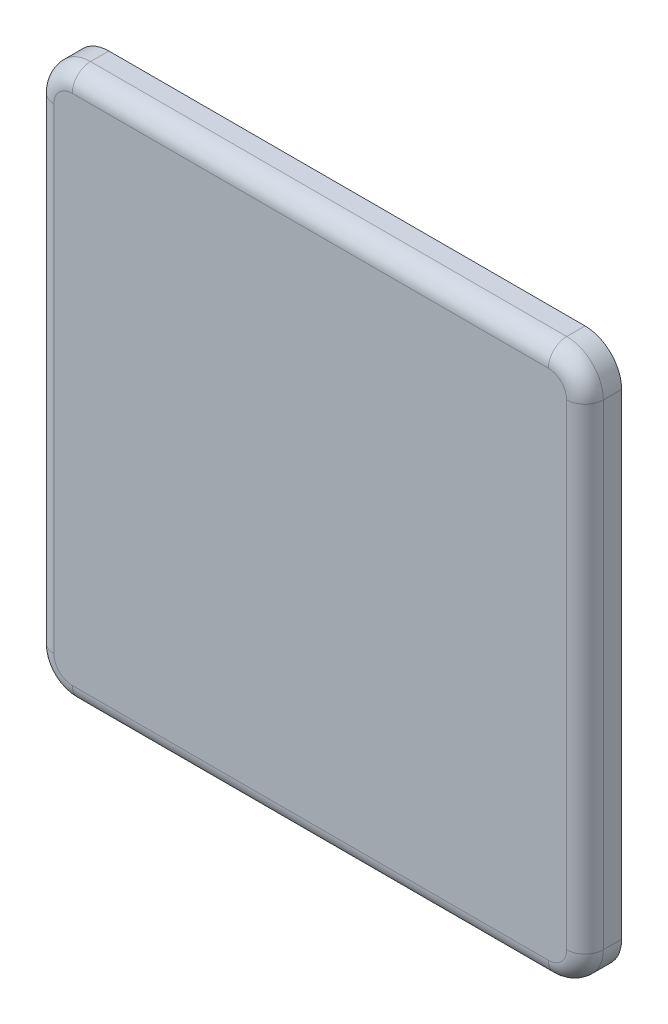
ISO-10303-21;
HEADER;
FILE_DESCRIPTION(('STEP AP214'),'2;1');
FILE_NAME('part.step','',(''),(''),'','','');
FILE_SCHEMA(('AUTOMOTIVE_DESIGN { 1 0 10303 214 1 1 1 1 }'));
ENDSEC;
DATA;
#1=APPLICATION_CONTEXT('core data for automotive mechanical design processes');
#2=APPLICATION_PROTOCOL_DEFINITION('international standard','automotive_design',2000,#1);
#3=PRODUCT_CONTEXT('',#1,'mechanical');
#4=PRODUCT('Part','Part','',(#3));
#5=PRODUCT_RELATED_PRODUCT_CATEGORY('part','',(#4));
#6=PRODUCT_DEFINITION_FORMATION('','',#4);
#7=PRODUCT_DEFINITION_CONTEXT('part definition',#1,'design');
#8=PRODUCT_DEFINITION('design','',#6,#7);
#9=PRODUCT_DEFINITION_SHAPE('','',#8);
#10=(LENGTH_UNIT() NAMED_UNIT(*) SI_UNIT(.MILLI.,.METRE.));
#11=(NAMED_UNIT(*) PLANE_ANGLE_UNIT() SI_UNIT($,.RADIAN.));
#12=(NAMED_UNIT(*) SI_UNIT($,.STERADIAN.) SOLID_ANGLE_UNIT());
#13=UNCERTAINTY_MEASURE_WITH_UNIT(LENGTH_MEASURE(1.E-05),#10,'distance_accuracy_value','');
#14=(GEOMETRIC_REPRESENTATION_CONTEXT(3) GLOBAL_UNCERTAINTY_ASSIGNED_CONTEXT((#13)) GLOBAL_UNIT_ASSIGNED_CONTEXT((#10,
#11,#12)) REPRESENTATION_CONTEXT('',''));
#15=CARTESIAN_POINT('',(0.,0.,0.));
#16=DIRECTION('',(0.,0.,1.));
#17=DIRECTION('',(1.,0.,0.));
#18=AXIS2_PLACEMENT_3D('',#15,#16,#17);
#19=CARTESIAN_POINT('',(0.,0.,0.));
#20=DIRECTION('',(0.,0.,1.));
#21=DIRECTION('',(1.,0.,0.));
#22=AXIS2_PLACEMENT_3D('',#19,#20,#21);
#23=PLANE('',#22);
#24=DIRECTION('',(1.,0.,0.));
#25=VECTOR('',#24,1.);
#26=CARTESIAN_POINT('',(-13.,15.,0.));
#27=LINE('',#26,#25);
#28=CARTESIAN_POINT('',(-13.,15.,0.));
#29=VERTEX_POINT('',#28);
#30=CARTESIAN_POINT('',(13.,15.,0.));
#31=VERTEX_POINT('',#30);
#32=EDGE_CURVE('E150',#29,#31,#27,.T.);
#33=ORIENTED_EDGE('',*,*,#32,.T.);
#34=CARTESIAN_POINT('',(13.,13.,0.));
#35=DIRECTION('',(0.,0.,-1.));
#36=DIRECTION('',(-1.,0.,0.));
#37=AXIS2_PLACEMENT_3D('',#34,#35,#36);
#38=CIRCLE('',#37,2.);
#39=CARTESIAN_POINT('',(15.,13.,0.));
#40=VERTEX_POINT('',#39);
#41=EDGE_CURVE('E55',#31,#40,#38,.T.);
#42=ORIENTED_EDGE('',*,*,#41,.T.);
#43=DIRECTION('',(0.,-1.,0.));
#44=VECTOR('',#43,1.);
#45=CARTESIAN_POINT('',(15.,13.,0.));
#46=LINE('',#45,#44);
#47=CARTESIAN_POINT('',(15.,-13.,0.));
#48=VERTEX_POINT('',#47);
#49=EDGE_CURVE('E211',#40,#48,#46,.T.);
#50=ORIENTED_EDGE('',*,*,#49,.T.);
#51=CARTESIAN_POINT('',(13.,-13.,0.));
#52=DIRECTION('',(0.,0.,-1.));
#53=DIRECTION('',(0.,1.,0.));
#54=AXIS2_PLACEMENT_3D('',#51,#52,#53);
#55=CIRCLE('',#54,2.);
#56=CARTESIAN_POINT('',(13.,-15.,0.));
#57=VERTEX_POINT('',#56);
#58=EDGE_CURVE('E110',#48,#57,#55,.T.);
#59=ORIENTED_EDGE('',*,*,#58,.T.);
#60=DIRECTION('',(-1.,0.,0.));
#61=VECTOR('',#60,1.);
#62=CARTESIAN_POINT('',(13.,-15.,0.));
#63=LINE('',#62,#61);
#64=CARTESIAN_POINT('',(-13.,-15.,0.));
#65=VERTEX_POINT('',#64);
#66=EDGE_CURVE('E109',#57,#65,#63,.T.);
#67=ORIENTED_EDGE('',*,*,#66,.T.);
#68=CARTESIAN_POINT('',(-13.,-13.,0.));
#69=DIRECTION('',(0.,0.,-1.));
#70=DIRECTION('',(1.,0.,0.));
#71=AXIS2_PLACEMENT_3D('',#68,#69,#70);
#72=CIRCLE('',#71,2.);
#73=CARTESIAN_POINT('',(-15.,-13.,0.));
#74=VERTEX_POINT('',#73);
#75=EDGE_CURVE('E106',#65,#74,#72,.T.);
#76=ORIENTED_EDGE('',*,*,#75,.T.);
#77=DIRECTION('',(0.,1.,0.));
#78=VECTOR('',#77,1.);
#79=CARTESIAN_POINT('',(-15.,-13.,0.));
#80=LINE('',#79,#78);
#81=CARTESIAN_POINT('',(-15.,13.,0.));
#82=VERTEX_POINT('',#81);
#83=EDGE_CURVE('E25',#74,#82,#80,.T.);
#84=ORIENTED_EDGE('',*,*,#83,.T.);
#85=CARTESIAN_POINT('',(-13.,13.,0.));
#86=DIRECTION('',(0.,0.,-1.));
#87=DIRECTION('',(0.,-1.,0.));
#88=AXIS2_PLACEMENT_3D('',#85,#86,#87);
#89=CIRCLE('',#88,2.);
#90=EDGE_CURVE('E10',#82,#29,#89,.T.);
#91=ORIENTED_EDGE('',*,*,#90,.T.);
#92=EDGE_LOOP('',(#33,#42,#50,#59,#67,#76,#84,#91));
#93=FACE_BOUND('',#92,.T.);
#94=ADVANCED_FACE('F15',(#93),#23,.F.);
#95=CARTESIAN_POINT('',(-13.,13.,0.));
#96=DIRECTION('',(0.,0.,-1.));
#97=DIRECTION('',(0.,-1.,0.));
#98=AXIS2_PLACEMENT_3D('',#95,#96,#97);
#99=CYLINDRICAL_SURFACE('',#98,2.);
#100=CARTESIAN_POINT('',(-13.,13.,1.));
#101=DIRECTION('',(0.,0.,1.));
#102=DIRECTION('',(-0.707106781186548,0.707106781186548,0.));
#103=AXIS2_PLACEMENT_3D('',#100,#101,#102);
#104=CIRCLE('',#103,2.);
#105=CARTESIAN_POINT('',(-13.,15.,1.));
#106=VERTEX_POINT('',#105);
#107=CARTESIAN_POINT('',(-15.,13.,1.));
#108=VERTEX_POINT('',#107);
#109=EDGE_CURVE('E205',#106,#108,#104,.T.);
#110=ORIENTED_EDGE('',*,*,#109,.F.);
#111=DIRECTION('',(0.,0.,1.));
#112=VECTOR('',#111,1.);
#113=CARTESIAN_POINT('',(-13.,15.,0.));
#114=LINE('',#113,#112);
#115=EDGE_CURVE('E152',#29,#106,#114,.T.);
#116=ORIENTED_EDGE('',*,*,#115,.F.);
#117=ORIENTED_EDGE('',*,*,#90,.F.);
#118=DIRECTION('',(0.,0.,1.));
#119=VECTOR('',#118,1.);
#120=CARTESIAN_POINT('',(-15.,13.,0.));
#121=LINE('',#120,#119);
#122=EDGE_CURVE('E142',#82,#108,#121,.T.);
#123=ORIENTED_EDGE('',*,*,#122,.T.);
#124=EDGE_LOOP('',(#110,#116,#117,#123));
#125=FACE_BOUND('',#124,.T.);
#126=ADVANCED_FACE('F233',(#125),#99,.T.);
#127=CARTESIAN_POINT('',(-15.,13.,0.));
#128=DIRECTION('',(-1.,0.,0.));
#129=DIRECTION('',(0.,-1.,0.));
#130=AXIS2_PLACEMENT_3D('',#127,#128,#129);
#131=PLANE('',#130);
#132=DIRECTION('',(0.,-1.,0.));
#133=VECTOR('',#132,1.);
#134=CARTESIAN_POINT('',(-15.,6.5,1.));
#135=LINE('',#134,#133);
#136=CARTESIAN_POINT('',(-15.,-13.,1.));
#137=VERTEX_POINT('',#136);
#138=EDGE_CURVE('E135',#108,#137,#135,.T.);
#139=ORIENTED_EDGE('',*,*,#138,.F.);
#140=ORIENTED_EDGE('',*,*,#122,.F.);
#141=ORIENTED_EDGE('',*,*,#83,.F.);
#142=DIRECTION('',(0.,0.,1.));
#143=VECTOR('',#142,1.);
#144=CARTESIAN_POINT('',(-15.,-13.,0.));
#145=LINE('',#144,#143);
#146=EDGE_CURVE('E149',#74,#137,#145,.T.);
#147=ORIENTED_EDGE('',*,*,#146,.T.);
#148=EDGE_LOOP('',(#139,#140,#141,#147));
#149=FACE_BOUND('',#148,.T.);
#150=ADVANCED_FACE('F236',(#149),#131,.T.);
#151=CARTESIAN_POINT('',(-13.,-13.,0.));
#152=DIRECTION('',(0.,0.,-1.));
#153=DIRECTION('',(1.,0.,0.));
#154=AXIS2_PLACEMENT_3D('',#151,#152,#153);
#155=CYLINDRICAL_SURFACE('',#154,2.);
#156=CARTESIAN_POINT('',(-13.,-13.,1.));
#157=DIRECTION('',(0.,0.,1.));
#158=DIRECTION('',(-0.707106781186548,-0.707106781186548,0.));
#159=AXIS2_PLACEMENT_3D('',#156,#157,#158);
#160=CIRCLE('',#159,2.);
#161=CARTESIAN_POINT('',(-13.,-15.,1.));
#162=VERTEX_POINT('',#161);
#163=EDGE_CURVE('E103',#137,#162,#160,.T.);
#164=ORIENTED_EDGE('',*,*,#163,.F.);
#165=ORIENTED_EDGE('',*,*,#146,.F.);
#166=ORIENTED_EDGE('',*,*,#75,.F.);
#167=DIRECTION('',(0.,0.,1.));
#168=VECTOR('',#167,1.);
#169=CARTESIAN_POINT('',(-13.,-15.,0.));
#170=LINE('',#169,#168);
#171=EDGE_CURVE('E98',#65,#162,#170,.T.);
#172=ORIENTED_EDGE('',*,*,#171,.T.);
#173=EDGE_LOOP('',(#164,#165,#166,#172));
#174=FACE_BOUND('',#173,.T.);
#175=ADVANCED_FACE('F100',(#174),#155,.T.);
#176=CARTESIAN_POINT('',(-13.,-15.,0.));
#177=DIRECTION('',(0.,-1.,0.));
#178=DIRECTION('',(1.,0.,0.));
#179=AXIS2_PLACEMENT_3D('',#176,#177,#178);
#180=PLANE('',#179);
#181=DIRECTION('',(1.,0.,0.));
#182=VECTOR('',#181,1.);
#183=CARTESIAN_POINT('',(-6.5,-15.,1.));
#184=LINE('',#183,#182);
#185=CARTESIAN_POINT('',(13.,-15.,1.));
#186=VERTEX_POINT('',#185);
#187=EDGE_CURVE('E113',#162,#186,#184,.T.);
#188=ORIENTED_EDGE('',*,*,#187,.F.);
#189=ORIENTED_EDGE('',*,*,#171,.F.);
#190=ORIENTED_EDGE('',*,*,#66,.F.);
#191=DIRECTION('',(0.,0.,1.));
#192=VECTOR('',#191,1.);
#193=CARTESIAN_POINT('',(13.,-15.,0.));
#194=LINE('',#193,#192);
#195=EDGE_CURVE('E116',#57,#186,#194,.T.);
#196=ORIENTED_EDGE('',*,*,#195,.T.);
#197=EDGE_LOOP('',(#188,#189,#190,#196));
#198=FACE_BOUND('',#197,.T.);
#199=ADVANCED_FACE('F114',(#198),#180,.T.);
#200=CARTESIAN_POINT('',(0.,0.,2.));
#201=DIRECTION('',(0.,0.,1.));
#202=DIRECTION('',(1.,0.,0.));
#203=AXIS2_PLACEMENT_3D('',#200,#201,#202);
#204=PLANE('',#203);
#205=CARTESIAN_POINT('',(13.,-13.,2.));
#206=DIRECTION('',(0.,0.,-1.));
#207=DIRECTION('',(0.707106781186548,-0.707106781186547,0.));
#208=AXIS2_PLACEMENT_3D('',#205,#206,#207);
#209=CIRCLE('',#208,1.);
#210=CARTESIAN_POINT('',(14.,-13.,2.));
#211=VERTEX_POINT('',#210);
#212=CARTESIAN_POINT('',(13.,-14.,2.));
#213=VERTEX_POINT('',#212);
#214=EDGE_CURVE('E153',#211,#213,#209,.T.);
#215=ORIENTED_EDGE('',*,*,#214,.F.);
#216=DIRECTION('',(0.,-1.,0.));
#217=VECTOR('',#216,1.);
#218=CARTESIAN_POINT('',(14.,-6.5,2.));
#219=LINE('',#218,#217);
#220=CARTESIAN_POINT('',(14.,13.,2.));
#221=VERTEX_POINT('',#220);
#222=EDGE_CURVE('E161',#221,#211,#219,.T.);
#223=ORIENTED_EDGE('',*,*,#222,.F.);
#224=CARTESIAN_POINT('',(13.,13.,2.));
#225=DIRECTION('',(0.,0.,-1.));
#226=DIRECTION('',(0.707106781186547,0.707106781186548,0.));
#227=AXIS2_PLACEMENT_3D('',#224,#225,#226);
#228=CIRCLE('',#227,1.);
#229=CARTESIAN_POINT('',(13.,14.,2.));
#230=VERTEX_POINT('',#229);
#231=EDGE_CURVE('E190',#230,#221,#228,.T.);
#232=ORIENTED_EDGE('',*,*,#231,.F.);
#233=DIRECTION('',(1.,0.,0.));
#234=VECTOR('',#233,1.);
#235=CARTESIAN_POINT('',(6.5,14.,2.));
#236=LINE('',#235,#234);
#237=CARTESIAN_POINT('',(-13.,14.,2.));
#238=VERTEX_POINT('',#237);
#239=EDGE_CURVE('E167',#238,#230,#236,.T.);
#240=ORIENTED_EDGE('',*,*,#239,.F.);
#241=CARTESIAN_POINT('',(-13.,13.,2.));
#242=DIRECTION('',(0.,0.,-1.));
#243=DIRECTION('',(-0.707106781186548,0.707106781186548,0.));
#244=AXIS2_PLACEMENT_3D('',#241,#242,#243);
#245=CIRCLE('',#244,1.);
#246=CARTESIAN_POINT('',(-14.,13.,2.));
#247=VERTEX_POINT('',#246);
#248=EDGE_CURVE('E208',#247,#238,#245,.T.);
#249=ORIENTED_EDGE('',*,*,#248,.F.);
#250=DIRECTION('',(0.,1.,0.));
#251=VECTOR('',#250,1.);
#252=CARTESIAN_POINT('',(-14.,6.5,2.));
#253=LINE('',#252,#251);
#254=CARTESIAN_POINT('',(-14.,-13.,2.));
#255=VERTEX_POINT('',#254);
#256=EDGE_CURVE('E19',#255,#247,#253,.T.);
#257=ORIENTED_EDGE('',*,*,#256,.F.);
#258=CARTESIAN_POINT('',(-13.,-13.,2.));
#259=DIRECTION('',(0.,0.,-1.));
#260=DIRECTION('',(-0.707106781186548,-0.707106781186548,0.));
#261=AXIS2_PLACEMENT_3D('',#258,#259,#260);
#262=CIRCLE('',#261,1.);
#263=CARTESIAN_POINT('',(-13.,-14.,2.));
#264=VERTEX_POINT('',#263);
#265=EDGE_CURVE('E131',#264,#255,#262,.T.);
#266=ORIENTED_EDGE('',*,*,#265,.F.);
#267=DIRECTION('',(-1.,0.,0.));
#268=VECTOR('',#267,1.);
#269=CARTESIAN_POINT('',(-6.5,-14.,2.));
#270=LINE('',#269,#268);
#271=EDGE_CURVE('E122',#213,#264,#270,.T.);
#272=ORIENTED_EDGE('',*,*,#271,.F.);
#273=EDGE_LOOP('',(#215,#223,#232,#240,#249,#257,#266,#272));
#274=FACE_BOUND('',#273,.T.);
#275=ADVANCED_FACE('F222',(#274),#204,.T.);
#276=CARTESIAN_POINT('',(13.,-13.,0.));
#277=DIRECTION('',(0.,0.,-1.));
#278=DIRECTION('',(0.,1.,0.));
#279=AXIS2_PLACEMENT_3D('',#276,#277,#278);
#280=CYLINDRICAL_SURFACE('',#279,2.);
#281=CARTESIAN_POINT('',(13.,-13.,1.));
#282=DIRECTION('',(0.,0.,1.));
#283=DIRECTION('',(0.707106781186548,-0.707106781186547,0.));
#284=AXIS2_PLACEMENT_3D('',#281,#282,#283);
#285=CIRCLE('',#284,2.);
#286=CARTESIAN_POINT('',(15.,-13.,1.));
#287=VERTEX_POINT('',#286);
#288=EDGE_CURVE('E143',#186,#287,#285,.T.);
#289=ORIENTED_EDGE('',*,*,#288,.F.);
#290=ORIENTED_EDGE('',*,*,#195,.F.);
#291=ORIENTED_EDGE('',*,*,#58,.F.);
#292=DIRECTION('',(0.,0.,1.));
#293=VECTOR('',#292,1.);
#294=CARTESIAN_POINT('',(15.,-13.,0.));
#295=LINE('',#294,#293);
#296=EDGE_CURVE('E209',#48,#287,#295,.T.);
#297=ORIENTED_EDGE('',*,*,#296,.T.);
#298=EDGE_LOOP('',(#289,#290,#291,#297));
#299=FACE_BOUND('',#298,.T.);
#300=ADVANCED_FACE('F292',(#299),#280,.T.);
#301=CARTESIAN_POINT('',(15.,-13.,0.));
#302=DIRECTION('',(1.,0.,0.));
#303=DIRECTION('',(0.,1.,0.));
#304=AXIS2_PLACEMENT_3D('',#301,#302,#303);
#305=PLANE('',#304);
#306=DIRECTION('',(0.,1.,0.));
#307=VECTOR('',#306,1.);
#308=CARTESIAN_POINT('',(15.,-6.5,1.));
#309=LINE('',#308,#307);
#310=CARTESIAN_POINT('',(15.,13.,1.));
#311=VERTEX_POINT('',#310);
#312=EDGE_CURVE('E157',#287,#311,#309,.T.);
#313=ORIENTED_EDGE('',*,*,#312,.F.);
#314=ORIENTED_EDGE('',*,*,#296,.F.);
#315=ORIENTED_EDGE('',*,*,#49,.F.);
#316=DIRECTION('',(0.,0.,1.));
#317=VECTOR('',#316,1.);
#318=CARTESIAN_POINT('',(15.,13.,0.));
#319=LINE('',#318,#317);
#320=EDGE_CURVE('E199',#40,#311,#319,.T.);
#321=ORIENTED_EDGE('',*,*,#320,.T.);
#322=EDGE_LOOP('',(#313,#314,#315,#321));
#323=FACE_BOUND('',#322,.T.);
#324=ADVANCED_FACE('F253',(#323),#305,.T.);
#325=CARTESIAN_POINT('',(13.,13.,0.));
#326=DIRECTION('',(0.,0.,-1.));
#327=DIRECTION('',(-1.,0.,0.));
#328=AXIS2_PLACEMENT_3D('',#325,#326,#327);
#329=CYLINDRICAL_SURFACE('',#328,2.);
#330=CARTESIAN_POINT('',(13.,13.,1.));
#331=DIRECTION('',(0.,0.,1.));
#332=DIRECTION('',(0.707106781186547,0.707106781186548,0.));
#333=AXIS2_PLACEMENT_3D('',#330,#331,#332);
#334=CIRCLE('',#333,2.);
#335=CARTESIAN_POINT('',(13.,15.,1.));
#336=VERTEX_POINT('',#335);
#337=EDGE_CURVE('E172',#311,#336,#334,.T.);
#338=ORIENTED_EDGE('',*,*,#337,.F.);
#339=ORIENTED_EDGE('',*,*,#320,.F.);
#340=ORIENTED_EDGE('',*,*,#41,.F.);
#341=DIRECTION('',(0.,0.,1.));
#342=VECTOR('',#341,1.);
#343=CARTESIAN_POINT('',(13.,15.,0.));
#344=LINE('',#343,#342);
#345=EDGE_CURVE('E121',#31,#336,#344,.T.);
#346=ORIENTED_EDGE('',*,*,#345,.T.);
#347=EDGE_LOOP('',(#338,#339,#340,#346));
#348=FACE_BOUND('',#347,.T.);
#349=ADVANCED_FACE('F176',(#348),#329,.T.);
#350=CARTESIAN_POINT('',(13.,15.,0.));
#351=DIRECTION('',(0.,1.,0.));
#352=DIRECTION('',(-1.,0.,0.));
#353=AXIS2_PLACEMENT_3D('',#350,#351,#352);
#354=PLANE('',#353);
#355=DIRECTION('',(-1.,0.,0.));
#356=VECTOR('',#355,1.);
#357=CARTESIAN_POINT('',(6.5,15.,1.));
#358=LINE('',#357,#356);
#359=EDGE_CURVE('E164',#336,#106,#358,.T.);
#360=ORIENTED_EDGE('',*,*,#359,.F.);
#361=ORIENTED_EDGE('',*,*,#345,.F.);
#362=ORIENTED_EDGE('',*,*,#32,.F.);
#363=ORIENTED_EDGE('',*,*,#115,.T.);
#364=EDGE_LOOP('',(#360,#361,#362,#363));
#365=FACE_BOUND('',#364,.T.);
#366=ADVANCED_FACE('F181',(#365),#354,.T.);
#367=CARTESIAN_POINT('',(-6.5,-14.,1.));
#368=DIRECTION('',(-1.,0.,0.));
#369=DIRECTION('',(0.,-0.707106781186548,0.707106781186547));
#370=AXIS2_PLACEMENT_3D('',#367,#368,#369);
#371=CYLINDRICAL_SURFACE('',#370,1.);
#372=CARTESIAN_POINT('',(13.,-14.,1.));
#373=DIRECTION('',(1.,0.,0.));
#374=DIRECTION('',(0.,0.,1.));
#375=AXIS2_PLACEMENT_3D('',#372,#373,#374);
#376=CIRCLE('',#375,1.);
#377=EDGE_CURVE('E147',#213,#186,#376,.T.);
#378=ORIENTED_EDGE('',*,*,#377,.F.);
#379=ORIENTED_EDGE('',*,*,#271,.T.);
#380=CARTESIAN_POINT('',(-13.,-14.,1.));
#381=DIRECTION('',(-1.,0.,0.));
#382=DIRECTION('',(0.,-1.,0.));
#383=AXIS2_PLACEMENT_3D('',#380,#381,#382);
#384=CIRCLE('',#383,1.);
#385=EDGE_CURVE('E128',#162,#264,#384,.T.);
#386=ORIENTED_EDGE('',*,*,#385,.F.);
#387=ORIENTED_EDGE('',*,*,#187,.T.);
#388=EDGE_LOOP('',(#378,#379,#386,#387));
#389=FACE_BOUND('',#388,.T.);
#390=ADVANCED_FACE('F133',(#389),#371,.T.);
#391=CARTESIAN_POINT('',(-13.,-13.,0.999999999999987));
#392=DIRECTION('',(0.,0.,1.));
#393=DIRECTION('',(1.,0.,0.));
#394=AXIS2_PLACEMENT_3D('',#391,#392,#393);
#395=DEGENERATE_TOROIDAL_SURFACE('',#394,0.999999999999977,1.,.T.);
#396=ORIENTED_EDGE('',*,*,#385,.T.);
#397=ORIENTED_EDGE('',*,*,#265,.T.);
#398=CARTESIAN_POINT('',(-14.,-13.,1.));
#399=DIRECTION('',(0.,1.,0.));
#400=DIRECTION('',(-1.,0.,0.));
#401=AXIS2_PLACEMENT_3D('',#398,#399,#400);
#402=CIRCLE('',#401,1.);
#403=EDGE_CURVE('E130',#137,#255,#402,.T.);
#404=ORIENTED_EDGE('',*,*,#403,.F.);
#405=ORIENTED_EDGE('',*,*,#163,.T.);
#406=EDGE_LOOP('',(#396,#397,#404,#405));
#407=FACE_BOUND('',#406,.T.);
#408=ADVANCED_FACE('F127',(#407),#395,.T.);
#409=CARTESIAN_POINT('',(-14.,6.5,1.));
#410=DIRECTION('',(0.,1.,0.));
#411=DIRECTION('',(-0.707106781186549,0.,0.707106781186546));
#412=AXIS2_PLACEMENT_3D('',#409,#410,#411);
#413=CYLINDRICAL_SURFACE('',#412,1.);
#414=ORIENTED_EDGE('',*,*,#403,.T.);
#415=ORIENTED_EDGE('',*,*,#256,.T.);
#416=CARTESIAN_POINT('',(-14.,13.,1.));
#417=DIRECTION('',(0.,1.,0.));
#418=DIRECTION('',(-1.,0.,0.));
#419=AXIS2_PLACEMENT_3D('',#416,#417,#418);
#420=CIRCLE('',#419,1.);
#421=EDGE_CURVE('E166',#108,#247,#420,.T.);
#422=ORIENTED_EDGE('',*,*,#421,.F.);
#423=ORIENTED_EDGE('',*,*,#138,.T.);
#424=EDGE_LOOP('',(#414,#415,#422,#423));
#425=FACE_BOUND('',#424,.T.);
#426=ADVANCED_FACE('F244',(#425),#413,.T.);
#427=CARTESIAN_POINT('',(-13.,13.,1.));
#428=DIRECTION('',(0.,0.,1.));
#429=DIRECTION('',(1.,0.,0.));
#430=AXIS2_PLACEMENT_3D('',#427,#428,#429);
#431=DEGENERATE_TOROIDAL_SURFACE('',#430,1.,1.,.T.);
#432=ORIENTED_EDGE('',*,*,#421,.T.);
#433=ORIENTED_EDGE('',*,*,#248,.T.);
#434=CARTESIAN_POINT('',(-13.,14.,1.));
#435=DIRECTION('',(1.,0.,0.));
#436=DIRECTION('',(0.,1.,0.));
#437=AXIS2_PLACEMENT_3D('',#434,#435,#436);
#438=CIRCLE('',#437,1.);
#439=EDGE_CURVE('E169',#106,#238,#438,.T.);
#440=ORIENTED_EDGE('',*,*,#439,.F.);
#441=ORIENTED_EDGE('',*,*,#109,.T.);
#442=EDGE_LOOP('',(#432,#433,#440,#441));
#443=FACE_BOUND('',#442,.T.);
#444=ADVANCED_FACE('F241',(#443),#431,.T.);
#445=CARTESIAN_POINT('',(6.5,14.,1.));
#446=DIRECTION('',(1.,0.,0.));
#447=DIRECTION('',(0.,0.707106781186548,0.707106781186547));
#448=AXIS2_PLACEMENT_3D('',#445,#446,#447);
#449=CYLINDRICAL_SURFACE('',#448,1.);
#450=ORIENTED_EDGE('',*,*,#439,.T.);
#451=ORIENTED_EDGE('',*,*,#239,.T.);
#452=CARTESIAN_POINT('',(13.,14.,1.));
#453=DIRECTION('',(1.,0.,0.));
#454=DIRECTION('',(0.,1.,0.));
#455=AXIS2_PLACEMENT_3D('',#452,#453,#454);
#456=CIRCLE('',#455,1.);
#457=EDGE_CURVE('E160',#336,#230,#456,.T.);
#458=ORIENTED_EDGE('',*,*,#457,.F.);
#459=ORIENTED_EDGE('',*,*,#359,.T.);
#460=EDGE_LOOP('',(#450,#451,#458,#459));
#461=FACE_BOUND('',#460,.T.);
#462=ADVANCED_FACE('F192',(#461),#449,.T.);
#463=CARTESIAN_POINT('',(13.,13.,0.999999999999989));
#464=DIRECTION('',(0.,0.,1.));
#465=DIRECTION('',(1.,0.,0.));
#466=AXIS2_PLACEMENT_3D('',#463,#464,#465);
#467=DEGENERATE_TOROIDAL_SURFACE('',#466,1.,1.,.T.);
#468=ORIENTED_EDGE('',*,*,#457,.T.);
#469=ORIENTED_EDGE('',*,*,#231,.T.);
#470=CARTESIAN_POINT('',(14.,13.,1.));
#471=DIRECTION('',(0.,-1.,0.));
#472=DIRECTION('',(1.,0.,0.));
#473=AXIS2_PLACEMENT_3D('',#470,#471,#472);
#474=CIRCLE('',#473,1.);
#475=EDGE_CURVE('E156',#311,#221,#474,.T.);
#476=ORIENTED_EDGE('',*,*,#475,.F.);
#477=ORIENTED_EDGE('',*,*,#337,.T.);
#478=EDGE_LOOP('',(#468,#469,#476,#477));
#479=FACE_BOUND('',#478,.T.);
#480=ADVANCED_FACE('F189',(#479),#467,.T.);
#481=CARTESIAN_POINT('',(14.,-6.5,1.));
#482=DIRECTION('',(0.,-1.,0.));
#483=DIRECTION('',(0.707106781186548,0.,0.707106781186547));
#484=AXIS2_PLACEMENT_3D('',#481,#482,#483);
#485=CYLINDRICAL_SURFACE('',#484,1.);
#486=ORIENTED_EDGE('',*,*,#475,.T.);
#487=ORIENTED_EDGE('',*,*,#222,.T.);
#488=CARTESIAN_POINT('',(14.,-13.,1.));
#489=DIRECTION('',(0.,-1.,0.));
#490=DIRECTION('',(1.,0.,0.));
#491=AXIS2_PLACEMENT_3D('',#488,#489,#490);
#492=CIRCLE('',#491,1.);
#493=EDGE_CURVE('E146',#287,#211,#492,.T.);
#494=ORIENTED_EDGE('',*,*,#493,.F.);
#495=ORIENTED_EDGE('',*,*,#312,.T.);
#496=EDGE_LOOP('',(#486,#487,#494,#495));
#497=FACE_BOUND('',#496,.T.);
#498=ADVANCED_FACE('F17',(#497),#485,.T.);
#499=CARTESIAN_POINT('',(13.,-13.,1.));
#500=DIRECTION('',(0.,0.,1.));
#501=DIRECTION('',(1.,0.,0.));
#502=AXIS2_PLACEMENT_3D('',#499,#500,#501);
#503=DEGENERATE_TOROIDAL_SURFACE('',#502,0.999999999999981,1.,.T.);
#504=ORIENTED_EDGE('',*,*,#377,.T.);
#505=ORIENTED_EDGE('',*,*,#288,.T.);
#506=ORIENTED_EDGE('',*,*,#493,.T.);
#507=ORIENTED_EDGE('',*,*,#214,.T.);
#508=EDGE_LOOP('',(#504,#505,#506,#507));
#509=FACE_BOUND('',#508,.T.);
#510=ADVANCED_FACE('F217',(#509),#503,.T.);
#511=CLOSED_SHELL('',(#94,#126,#150,#175,#199,#275,#300,#324,#349,#366,#390,#408,#426,#444,#462,
#480,#498,#510));
#512=MANIFOLD_SOLID_BREP('B1',#511);
#513=ADVANCED_BREP_SHAPE_REPRESENTATION('',(#18,#512),#14);
#514=SHAPE_DEFINITION_REPRESENTATION(#9,#513);
ENDSEC;
END-ISO-10303-21;
